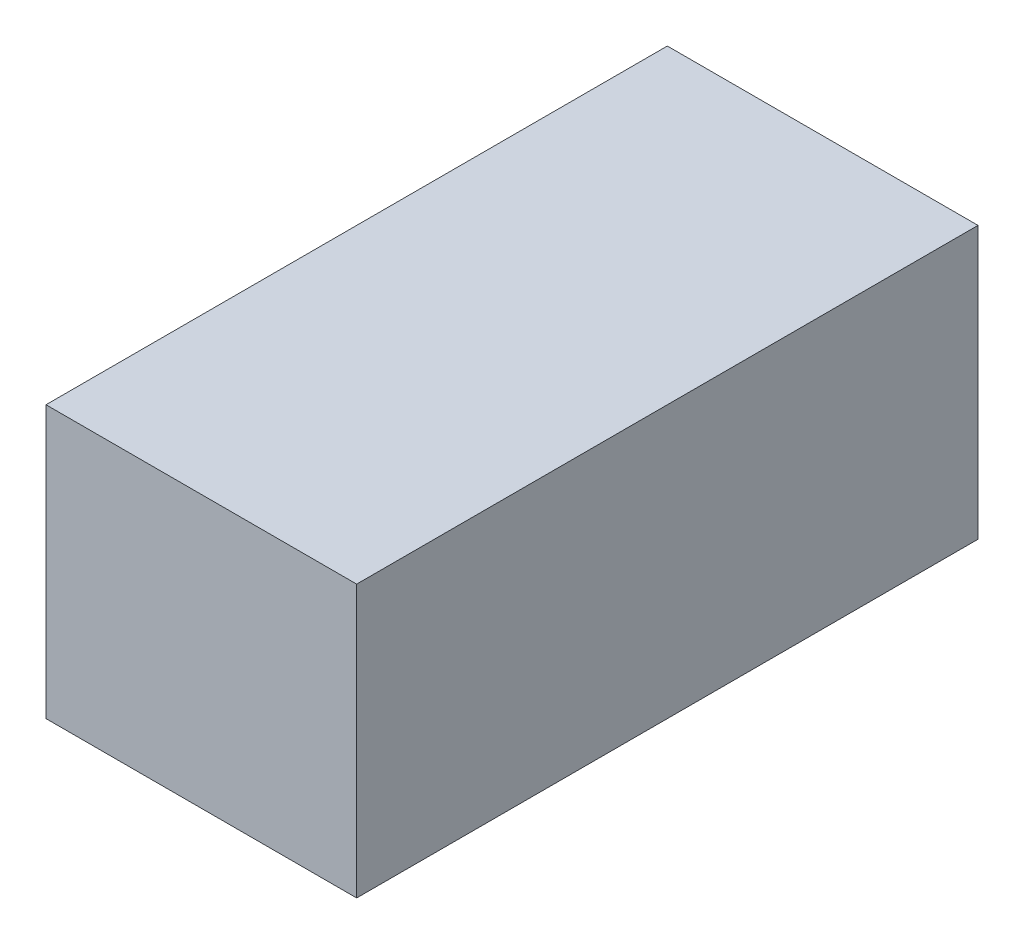
ISO-10303-21;
HEADER;
FILE_DESCRIPTION(('STEP AP214'),'2;1');
FILE_NAME('part.step','',(''),(''),'','','');
FILE_SCHEMA(('AUTOMOTIVE_DESIGN { 1 0 10303 214 1 1 1 1 }'));
ENDSEC;
DATA;
#1=APPLICATION_CONTEXT('core data for automotive mechanical design processes');
#2=APPLICATION_PROTOCOL_DEFINITION('international standard','automotive_design',2000,#1);
#3=PRODUCT_CONTEXT('',#1,'mechanical');
#4=PRODUCT('Part','Part','',(#3));
#5=PRODUCT_RELATED_PRODUCT_CATEGORY('part','',(#4));
#6=PRODUCT_DEFINITION_FORMATION('','',#4);
#7=PRODUCT_DEFINITION_CONTEXT('part definition',#1,'design');
#8=PRODUCT_DEFINITION('design','',#6,#7);
#9=PRODUCT_DEFINITION_SHAPE('','',#8);
#10=(LENGTH_UNIT() NAMED_UNIT(*) SI_UNIT(.MILLI.,.METRE.));
#11=(NAMED_UNIT(*) PLANE_ANGLE_UNIT() SI_UNIT($,.RADIAN.));
#12=(NAMED_UNIT(*) SI_UNIT($,.STERADIAN.) SOLID_ANGLE_UNIT());
#13=UNCERTAINTY_MEASURE_WITH_UNIT(LENGTH_MEASURE(1.E-05),#10,'distance_accuracy_value','');
#14=(GEOMETRIC_REPRESENTATION_CONTEXT(3) GLOBAL_UNCERTAINTY_ASSIGNED_CONTEXT((#13)) GLOBAL_UNIT_ASSIGNED_CONTEXT((#10,
#11,#12)) REPRESENTATION_CONTEXT('',''));
#15=CARTESIAN_POINT('',(0.,0.,0.));
#16=DIRECTION('',(0.,0.,1.));
#17=DIRECTION('',(1.,0.,0.));
#18=AXIS2_PLACEMENT_3D('',#15,#16,#17);
#19=CARTESIAN_POINT('',(20.,-17.5,80.));
#20=DIRECTION('',(-1.,0.,0.));
#21=DIRECTION('',(0.,0.,1.));
#22=AXIS2_PLACEMENT_3D('',#19,#20,#21);
#23=PLANE('',#22);
#24=DIRECTION('',(0.,1.,0.));
#25=VECTOR('',#24,1.);
#26=CARTESIAN_POINT('',(20.,-17.5,0.));
#27=LINE('',#26,#25);
#28=CARTESIAN_POINT('',(20.,-17.5,0.));
#29=VERTEX_POINT('',#28);
#30=CARTESIAN_POINT('',(20.,17.5,0.));
#31=VERTEX_POINT('',#30);
#32=EDGE_CURVE('E100',#29,#31,#27,.T.);
#33=ORIENTED_EDGE('',*,*,#32,.T.);
#34=DIRECTION('',(0.,0.,-1.));
#35=VECTOR('',#34,1.);
#36=CARTESIAN_POINT('',(20.,17.5,80.));
#37=LINE('',#36,#35);
#38=CARTESIAN_POINT('',(20.,17.5,80.));
#39=VERTEX_POINT('',#38);
#40=EDGE_CURVE('E11',#39,#31,#37,.T.);
#41=ORIENTED_EDGE('',*,*,#40,.F.);
#42=DIRECTION('',(0.,1.,0.));
#43=VECTOR('',#42,1.);
#44=CARTESIAN_POINT('',(20.,-17.5,80.));
#45=LINE('',#44,#43);
#46=CARTESIAN_POINT('',(20.,-17.5,80.));
#47=VERTEX_POINT('',#46);
#48=EDGE_CURVE('E88',#47,#39,#45,.T.);
#49=ORIENTED_EDGE('',*,*,#48,.F.);
#50=DIRECTION('',(0.,0.,-1.));
#51=VECTOR('',#50,1.);
#52=CARTESIAN_POINT('',(20.,-17.5,80.));
#53=LINE('',#52,#51);
#54=EDGE_CURVE('E96',#47,#29,#53,.T.);
#55=ORIENTED_EDGE('',*,*,#54,.T.);
#56=EDGE_LOOP('',(#33,#41,#49,#55));
#57=FACE_BOUND('',#56,.T.);
#58=ADVANCED_FACE('F37',(#57),#23,.F.);
#59=CARTESIAN_POINT('',(-20.,17.5,80.));
#60=DIRECTION('',(0.,-1.,0.));
#61=DIRECTION('',(0.,0.,-1.));
#62=AXIS2_PLACEMENT_3D('',#59,#60,#61);
#63=PLANE('',#62);
#64=DIRECTION('',(-1.,0.,0.));
#65=VECTOR('',#64,1.);
#66=CARTESIAN_POINT('',(-20.,17.5,0.));
#67=LINE('',#66,#65);
#68=CARTESIAN_POINT('',(-20.,17.5,0.));
#69=VERTEX_POINT('',#68);
#70=EDGE_CURVE('E92',#31,#69,#67,.T.);
#71=ORIENTED_EDGE('',*,*,#70,.T.);
#72=DIRECTION('',(0.,0.,-1.));
#73=VECTOR('',#72,1.);
#74=CARTESIAN_POINT('',(-20.,17.5,80.));
#75=LINE('',#74,#73);
#76=CARTESIAN_POINT('',(-20.,17.5,80.));
#77=VERTEX_POINT('',#76);
#78=EDGE_CURVE('E45',#77,#69,#75,.T.);
#79=ORIENTED_EDGE('',*,*,#78,.F.);
#80=DIRECTION('',(-1.,0.,0.));
#81=VECTOR('',#80,1.);
#82=CARTESIAN_POINT('',(-20.,17.5,80.));
#83=LINE('',#82,#81);
#84=EDGE_CURVE('E83',#39,#77,#83,.T.);
#85=ORIENTED_EDGE('',*,*,#84,.F.);
#86=ORIENTED_EDGE('',*,*,#40,.T.);
#87=EDGE_LOOP('',(#71,#79,#85,#86));
#88=FACE_BOUND('',#87,.T.);
#89=ADVANCED_FACE('F91',(#88),#63,.F.);
#90=CARTESIAN_POINT('',(-20.,-17.5,80.));
#91=DIRECTION('',(1.,0.,0.));
#92=DIRECTION('',(0.,0.,-1.));
#93=AXIS2_PLACEMENT_3D('',#90,#91,#92);
#94=PLANE('',#93);
#95=DIRECTION('',(0.,-1.,0.));
#96=VECTOR('',#95,1.);
#97=CARTESIAN_POINT('',(-20.,-17.5,0.));
#98=LINE('',#97,#96);
#99=CARTESIAN_POINT('',(-20.,-17.5,0.));
#100=VERTEX_POINT('',#99);
#101=EDGE_CURVE('E70',#69,#100,#98,.T.);
#102=ORIENTED_EDGE('',*,*,#101,.T.);
#103=DIRECTION('',(0.,0.,-1.));
#104=VECTOR('',#103,1.);
#105=CARTESIAN_POINT('',(-20.,-17.5,80.));
#106=LINE('',#105,#104);
#107=CARTESIAN_POINT('',(-20.,-17.5,80.));
#108=VERTEX_POINT('',#107);
#109=EDGE_CURVE('E93',#108,#100,#106,.T.);
#110=ORIENTED_EDGE('',*,*,#109,.F.);
#111=DIRECTION('',(0.,-1.,0.));
#112=VECTOR('',#111,1.);
#113=CARTESIAN_POINT('',(-20.,-17.5,80.));
#114=LINE('',#113,#112);
#115=EDGE_CURVE('E86',#77,#108,#114,.T.);
#116=ORIENTED_EDGE('',*,*,#115,.F.);
#117=ORIENTED_EDGE('',*,*,#78,.T.);
#118=EDGE_LOOP('',(#102,#110,#116,#117));
#119=FACE_BOUND('',#118,.T.);
#120=ADVANCED_FACE('F94',(#119),#94,.F.);
#121=CARTESIAN_POINT('',(-20.,-17.5,80.));
#122=DIRECTION('',(0.,1.,0.));
#123=DIRECTION('',(0.,0.,1.));
#124=AXIS2_PLACEMENT_3D('',#121,#122,#123);
#125=PLANE('',#124);
#126=DIRECTION('',(1.,0.,0.));
#127=VECTOR('',#126,1.);
#128=CARTESIAN_POINT('',(-20.,-17.5,0.));
#129=LINE('',#128,#127);
#130=EDGE_CURVE('E76',#100,#29,#129,.T.);
#131=ORIENTED_EDGE('',*,*,#130,.T.);
#132=ORIENTED_EDGE('',*,*,#54,.F.);
#133=DIRECTION('',(1.,0.,0.));
#134=VECTOR('',#133,1.);
#135=CARTESIAN_POINT('',(-20.,-17.5,80.));
#136=LINE('',#135,#134);
#137=EDGE_CURVE('E53',#108,#47,#136,.T.);
#138=ORIENTED_EDGE('',*,*,#137,.F.);
#139=ORIENTED_EDGE('',*,*,#109,.T.);
#140=EDGE_LOOP('',(#131,#132,#138,#139));
#141=FACE_BOUND('',#140,.T.);
#142=ADVANCED_FACE('F107',(#141),#125,.F.);
#143=CARTESIAN_POINT('',(0.,0.,80.));
#144=DIRECTION('',(0.,0.,-1.));
#145=DIRECTION('',(-1.,0.,0.));
#146=AXIS2_PLACEMENT_3D('',#143,#144,#145);
#147=PLANE('',#146);
#148=ORIENTED_EDGE('',*,*,#48,.T.);
#149=ORIENTED_EDGE('',*,*,#84,.T.);
#150=ORIENTED_EDGE('',*,*,#115,.T.);
#151=ORIENTED_EDGE('',*,*,#137,.T.);
#152=EDGE_LOOP('',(#148,#149,#150,#151));
#153=FACE_BOUND('',#152,.T.);
#154=ADVANCED_FACE('F84',(#153),#147,.F.);
#155=CARTESIAN_POINT('',(0.,0.,0.));
#156=DIRECTION('',(0.,0.,-1.));
#157=DIRECTION('',(-1.,0.,0.));
#158=AXIS2_PLACEMENT_3D('',#155,#156,#157);
#159=PLANE('',#158);
#160=ORIENTED_EDGE('',*,*,#32,.F.);
#161=ORIENTED_EDGE('',*,*,#130,.F.);
#162=ORIENTED_EDGE('',*,*,#101,.F.);
#163=ORIENTED_EDGE('',*,*,#70,.F.);
#164=EDGE_LOOP('',(#160,#161,#162,#163));
#165=FACE_BOUND('',#164,.T.);
#166=ADVANCED_FACE('F110',(#165),#159,.T.);
#167=CLOSED_SHELL('',(#58,#89,#120,#142,#154,#166));
#168=MANIFOLD_SOLID_BREP('B2',#167);
#169=ADVANCED_BREP_SHAPE_REPRESENTATION('',(#18,#168),#14);
#170=SHAPE_DEFINITION_REPRESENTATION(#9,#169);
ENDSEC;
END-ISO-10303-21;
